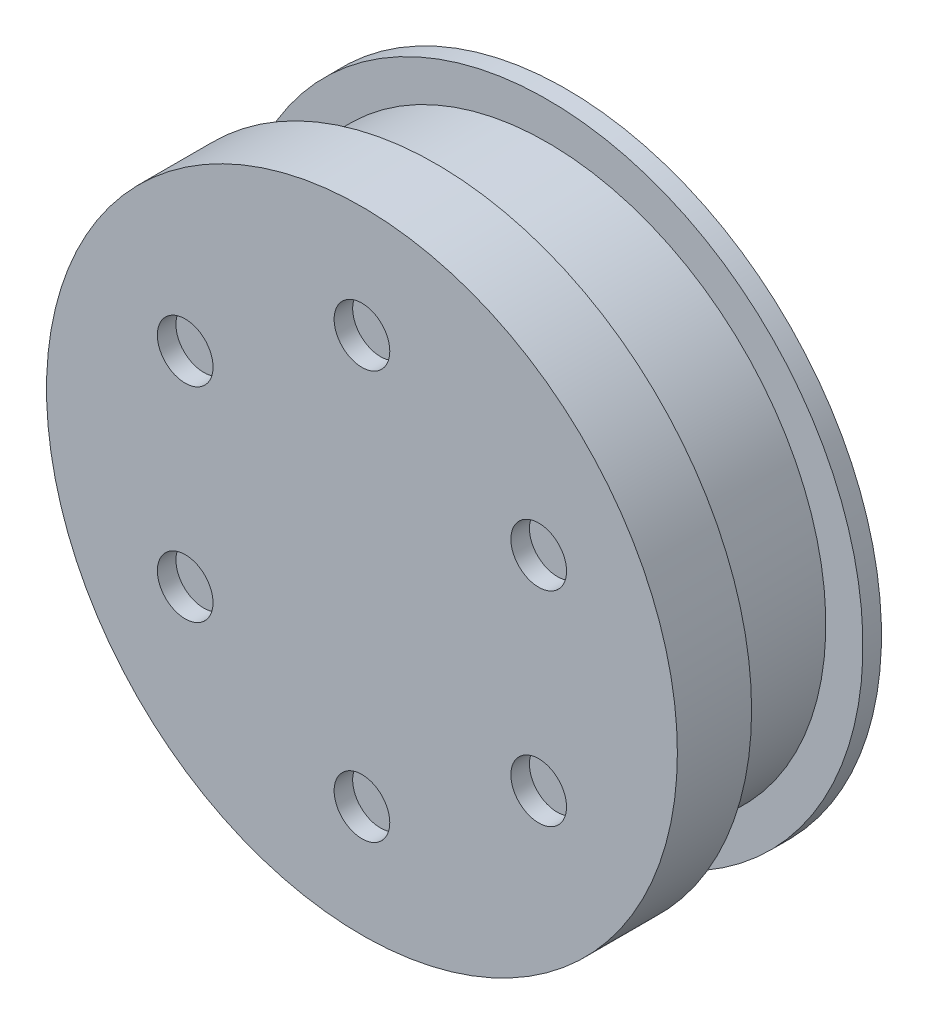
ISO-10303-21;
HEADER;
FILE_DESCRIPTION(('STEP AP214'),'2;1');
FILE_NAME('part.step','',(''),(''),'','','');
FILE_SCHEMA(('AUTOMOTIVE_DESIGN { 1 0 10303 214 1 1 1 1 }'));
ENDSEC;
DATA;
#1=APPLICATION_CONTEXT('core data for automotive mechanical design processes');
#2=APPLICATION_PROTOCOL_DEFINITION('international standard','automotive_design',2000,#1);
#3=PRODUCT_CONTEXT('',#1,'mechanical');
#4=PRODUCT('Part','Part','',(#3));
#5=PRODUCT_RELATED_PRODUCT_CATEGORY('part','',(#4));
#6=PRODUCT_DEFINITION_FORMATION('','',#4);
#7=PRODUCT_DEFINITION_CONTEXT('part definition',#1,'design');
#8=PRODUCT_DEFINITION('design','',#6,#7);
#9=PRODUCT_DEFINITION_SHAPE('','',#8);
#10=(LENGTH_UNIT() NAMED_UNIT(*) SI_UNIT(.MILLI.,.METRE.));
#11=(NAMED_UNIT(*) PLANE_ANGLE_UNIT() SI_UNIT($,.RADIAN.));
#12=(NAMED_UNIT(*) SI_UNIT($,.STERADIAN.) SOLID_ANGLE_UNIT());
#13=UNCERTAINTY_MEASURE_WITH_UNIT(LENGTH_MEASURE(1.E-05),#10,'distance_accuracy_value','');
#14=(GEOMETRIC_REPRESENTATION_CONTEXT(3) GLOBAL_UNCERTAINTY_ASSIGNED_CONTEXT((#13)) GLOBAL_UNIT_ASSIGNED_CONTEXT((#10,
#11,#12)) REPRESENTATION_CONTEXT('',''));
#15=CARTESIAN_POINT('',(0.,0.,0.));
#16=DIRECTION('',(0.,0.,1.));
#17=DIRECTION('',(1.,0.,0.));
#18=AXIS2_PLACEMENT_3D('',#15,#16,#17);
#19=CARTESIAN_POINT('',(0.,0.,8.));
#20=DIRECTION('',(0.,0.,-1.));
#21=DIRECTION('',(-1.,0.,0.));
#22=AXIS2_PLACEMENT_3D('',#19,#20,#21);
#23=CYLINDRICAL_SURFACE('',#22,15.);
#24=CARTESIAN_POINT('',(0.,0.,1.));
#25=DIRECTION('',(0.,0.,-1.));
#26=DIRECTION('',(-1.,0.,0.));
#27=AXIS2_PLACEMENT_3D('',#24,#25,#26);
#28=CIRCLE('',#27,15.);
#29=CARTESIAN_POINT('',(-15.,0.,1.));
#30=VERTEX_POINT('',#29);
#31=EDGE_CURVE('E45',#30,#30,#28,.T.);
#32=ORIENTED_EDGE('',*,*,#31,.F.);
#33=EDGE_LOOP('',(#32));
#34=FACE_BOUND('',#33,.T.);
#35=CARTESIAN_POINT('',(0.,0.,7.));
#36=DIRECTION('',(0.,0.,1.));
#37=DIRECTION('',(1.,0.,0.));
#38=AXIS2_PLACEMENT_3D('',#35,#36,#37);
#39=CIRCLE('',#38,15.);
#40=CARTESIAN_POINT('',(15.,0.,7.));
#41=VERTEX_POINT('',#40);
#42=EDGE_CURVE('E10',#41,#41,#39,.T.);
#43=ORIENTED_EDGE('',*,*,#42,.F.);
#44=EDGE_LOOP('',(#43));
#45=FACE_BOUND('',#44,.T.);
#46=ADVANCED_FACE('F39',(#34,#45),#23,.T.);
#47=CARTESIAN_POINT('',(0.,0.,1.));
#48=DIRECTION('',(0.,0.,-1.));
#49=DIRECTION('',(-1.,0.,0.));
#50=AXIS2_PLACEMENT_3D('',#47,#48,#49);
#51=CYLINDRICAL_SURFACE('',#50,17.);
#52=CARTESIAN_POINT('',(0.,0.,1.));
#53=DIRECTION('',(0.,0.,-1.));
#54=DIRECTION('',(-1.,0.,0.));
#55=AXIS2_PLACEMENT_3D('',#52,#53,#54);
#56=CIRCLE('',#55,17.);
#57=CARTESIAN_POINT('',(-17.,0.,1.));
#58=VERTEX_POINT('',#57);
#59=EDGE_CURVE('E49',#58,#58,#56,.T.);
#60=ORIENTED_EDGE('',*,*,#59,.T.);
#61=EDGE_LOOP('',(#60));
#62=FACE_BOUND('',#61,.T.);
#63=CARTESIAN_POINT('',(0.,0.,0.));
#64=DIRECTION('',(0.,0.,-1.));
#65=DIRECTION('',(-1.,0.,0.));
#66=AXIS2_PLACEMENT_3D('',#63,#64,#65);
#67=CIRCLE('',#66,17.);
#68=CARTESIAN_POINT('',(-17.,0.,0.));
#69=VERTEX_POINT('',#68);
#70=EDGE_CURVE('E53',#69,#69,#67,.T.);
#71=ORIENTED_EDGE('',*,*,#70,.F.);
#72=EDGE_LOOP('',(#71));
#73=FACE_BOUND('',#72,.T.);
#74=ADVANCED_FACE('F181',(#62,#73),#51,.T.);
#75=CARTESIAN_POINT('',(0.,0.,1.));
#76=DIRECTION('',(0.,0.,-1.));
#77=DIRECTION('',(-1.,0.,0.));
#78=AXIS2_PLACEMENT_3D('',#75,#76,#77);
#79=PLANE('',#78);
#80=ORIENTED_EDGE('',*,*,#31,.T.);
#81=EDGE_LOOP('',(#80));
#82=FACE_BOUND('',#81,.T.);
#83=ORIENTED_EDGE('',*,*,#59,.F.);
#84=EDGE_LOOP('',(#83));
#85=FACE_BOUND('',#84,.T.);
#86=ADVANCED_FACE('F186',(#82,#85),#79,.F.);
#87=CARTESIAN_POINT('',(0.,0.,0.));
#88=DIRECTION('',(0.,0.,1.));
#89=DIRECTION('',(1.,0.,0.));
#90=AXIS2_PLACEMENT_3D('',#87,#88,#89);
#91=PLANE('',#90);
#92=CARTESIAN_POINT('',(0.,11.,0.));
#93=DIRECTION('',(0.,0.,1.));
#94=DIRECTION('',(1.,0.,0.));
#95=AXIS2_PLACEMENT_3D('',#92,#93,#94);
#96=CIRCLE('',#95,1.5);
#97=CARTESIAN_POINT('',(1.5,11.,0.));
#98=VERTEX_POINT('',#97);
#99=EDGE_CURVE('E57',#98,#98,#96,.T.);
#100=ORIENTED_EDGE('',*,*,#99,.T.);
#101=EDGE_LOOP('',(#100));
#102=FACE_BOUND('',#101,.T.);
#103=CARTESIAN_POINT('',(-9.52627944162876,5.50000000000011,0.));
#104=DIRECTION('',(0.,0.,1.));
#105=DIRECTION('',(1.,0.,0.));
#106=AXIS2_PLACEMENT_3D('',#103,#104,#105);
#107=CIRCLE('',#106,1.5);
#108=CARTESIAN_POINT('',(-8.02627944162876,5.50000000000011,0.));
#109=VERTEX_POINT('',#108);
#110=EDGE_CURVE('E63',#109,#109,#107,.T.);
#111=ORIENTED_EDGE('',*,*,#110,.T.);
#112=EDGE_LOOP('',(#111));
#113=FACE_BOUND('',#112,.T.);
#114=CARTESIAN_POINT('',(-9.52627944162887,-5.49999999999991,0.));
#115=DIRECTION('',(0.,0.,1.));
#116=DIRECTION('',(1.,0.,0.));
#117=AXIS2_PLACEMENT_3D('',#114,#115,#116);
#118=CIRCLE('',#117,1.5);
#119=CARTESIAN_POINT('',(-8.02627944162887,-5.49999999999991,0.));
#120=VERTEX_POINT('',#119);
#121=EDGE_CURVE('E59',#120,#120,#118,.T.);
#122=ORIENTED_EDGE('',*,*,#121,.T.);
#123=EDGE_LOOP('',(#122));
#124=FACE_BOUND('',#123,.T.);
#125=CARTESIAN_POINT('',(0.,-11.,0.));
#126=DIRECTION('',(0.,0.,1.));
#127=DIRECTION('',(1.,0.,0.));
#128=AXIS2_PLACEMENT_3D('',#125,#126,#127);
#129=CIRCLE('',#128,1.5);
#130=CARTESIAN_POINT('',(1.49999999999992,-11.,0.));
#131=VERTEX_POINT('',#130);
#132=EDGE_CURVE('E62',#131,#131,#129,.T.);
#133=ORIENTED_EDGE('',*,*,#132,.T.);
#134=EDGE_LOOP('',(#133));
#135=FACE_BOUND('',#134,.T.);
#136=CARTESIAN_POINT('',(9.5262794416288,-5.50000000000005,0.));
#137=DIRECTION('',(0.,0.,1.));
#138=DIRECTION('',(1.,0.,0.));
#139=AXIS2_PLACEMENT_3D('',#136,#137,#138);
#140=CIRCLE('',#139,1.5);
#141=CARTESIAN_POINT('',(11.0262794416288,-5.50000000000005,0.));
#142=VERTEX_POINT('',#141);
#143=EDGE_CURVE('E71',#142,#142,#140,.T.);
#144=ORIENTED_EDGE('',*,*,#143,.T.);
#145=EDGE_LOOP('',(#144));
#146=FACE_BOUND('',#145,.T.);
#147=CARTESIAN_POINT('',(9.52627944162884,5.49999999999998,0.));
#148=DIRECTION('',(0.,0.,1.));
#149=DIRECTION('',(1.,0.,0.));
#150=AXIS2_PLACEMENT_3D('',#147,#148,#149);
#151=CIRCLE('',#150,1.5);
#152=CARTESIAN_POINT('',(11.0262794416288,5.49999999999998,0.));
#153=VERTEX_POINT('',#152);
#154=EDGE_CURVE('E77',#153,#153,#151,.T.);
#155=ORIENTED_EDGE('',*,*,#154,.T.);
#156=EDGE_LOOP('',(#155));
#157=FACE_BOUND('',#156,.T.);
#158=ORIENTED_EDGE('',*,*,#70,.T.);
#159=EDGE_LOOP('',(#158));
#160=FACE_BOUND('',#159,.T.);
#161=ADVANCED_FACE('F193',(#102,#113,#124,#135,#146,#157,#160),#91,.F.);
#162=CARTESIAN_POINT('',(9.52627944162884,5.49999999999998,0.));
#163=DIRECTION('',(0.,0.,1.));
#164=DIRECTION('',(1.,0.,0.));
#165=AXIS2_PLACEMENT_3D('',#162,#163,#164);
#166=CYLINDRICAL_SURFACE('',#165,1.5);
#167=ORIENTED_EDGE('',*,*,#154,.F.);
#168=EDGE_LOOP('',(#167));
#169=FACE_BOUND('',#168,.T.);
#170=CARTESIAN_POINT('',(9.52627944162884,5.49999999999998,8.));
#171=DIRECTION('',(0.,0.,1.));
#172=DIRECTION('',(1.,0.,0.));
#173=AXIS2_PLACEMENT_3D('',#170,#171,#172);
#174=CIRCLE('',#173,1.5);
#175=CARTESIAN_POINT('',(11.0262794416288,5.49999999999998,8.));
#176=VERTEX_POINT('',#175);
#177=EDGE_CURVE('E80',#176,#176,#174,.T.);
#178=ORIENTED_EDGE('',*,*,#177,.T.);
#179=EDGE_LOOP('',(#178));
#180=FACE_BOUND('',#179,.T.);
#181=ADVANCED_FACE('F198',(#169,#180),#166,.F.);
#182=CARTESIAN_POINT('',(9.5262794416288,-5.50000000000005,0.));
#183=DIRECTION('',(0.,0.,1.));
#184=DIRECTION('',(1.,0.,0.));
#185=AXIS2_PLACEMENT_3D('',#182,#183,#184);
#186=CYLINDRICAL_SURFACE('',#185,1.5);
#187=ORIENTED_EDGE('',*,*,#143,.F.);
#188=EDGE_LOOP('',(#187));
#189=FACE_BOUND('',#188,.T.);
#190=CARTESIAN_POINT('',(9.5262794416288,-5.50000000000005,8.));
#191=DIRECTION('',(0.,0.,1.));
#192=DIRECTION('',(1.,0.,0.));
#193=AXIS2_PLACEMENT_3D('',#190,#191,#192);
#194=CIRCLE('',#193,1.5);
#195=CARTESIAN_POINT('',(11.0262794416288,-5.50000000000005,8.));
#196=VERTEX_POINT('',#195);
#197=EDGE_CURVE('E74',#196,#196,#194,.T.);
#198=ORIENTED_EDGE('',*,*,#197,.T.);
#199=EDGE_LOOP('',(#198));
#200=FACE_BOUND('',#199,.T.);
#201=ADVANCED_FACE('F203',(#189,#200),#186,.F.);
#202=CARTESIAN_POINT('',(0.,-11.,0.));
#203=DIRECTION('',(0.,0.,1.));
#204=DIRECTION('',(1.,0.,0.));
#205=AXIS2_PLACEMENT_3D('',#202,#203,#204);
#206=CYLINDRICAL_SURFACE('',#205,1.5);
#207=ORIENTED_EDGE('',*,*,#132,.F.);
#208=EDGE_LOOP('',(#207));
#209=FACE_BOUND('',#208,.T.);
#210=CARTESIAN_POINT('',(0.,-11.,8.));
#211=DIRECTION('',(0.,0.,1.));
#212=DIRECTION('',(1.,0.,0.));
#213=AXIS2_PLACEMENT_3D('',#210,#211,#212);
#214=CIRCLE('',#213,1.5);
#215=CARTESIAN_POINT('',(1.49999999999992,-11.,8.));
#216=VERTEX_POINT('',#215);
#217=EDGE_CURVE('E68',#216,#216,#214,.T.);
#218=ORIENTED_EDGE('',*,*,#217,.T.);
#219=EDGE_LOOP('',(#218));
#220=FACE_BOUND('',#219,.T.);
#221=ADVANCED_FACE('F252',(#209,#220),#206,.F.);
#222=CARTESIAN_POINT('',(-9.52627944162887,-5.49999999999991,0.));
#223=DIRECTION('',(0.,0.,1.));
#224=DIRECTION('',(1.,0.,0.));
#225=AXIS2_PLACEMENT_3D('',#222,#223,#224);
#226=CYLINDRICAL_SURFACE('',#225,1.5);
#227=ORIENTED_EDGE('',*,*,#121,.F.);
#228=EDGE_LOOP('',(#227));
#229=FACE_BOUND('',#228,.T.);
#230=CARTESIAN_POINT('',(-9.52627944162887,-5.49999999999991,8.));
#231=DIRECTION('',(0.,0.,1.));
#232=DIRECTION('',(1.,0.,0.));
#233=AXIS2_PLACEMENT_3D('',#230,#231,#232);
#234=CIRCLE('',#233,1.5);
#235=CARTESIAN_POINT('',(-8.02627944162887,-5.49999999999991,8.));
#236=VERTEX_POINT('',#235);
#237=EDGE_CURVE('E64',#236,#236,#234,.T.);
#238=ORIENTED_EDGE('',*,*,#237,.T.);
#239=EDGE_LOOP('',(#238));
#240=FACE_BOUND('',#239,.T.);
#241=ADVANCED_FACE('F246',(#229,#240),#226,.F.);
#242=CARTESIAN_POINT('',(-9.52627944162876,5.50000000000011,0.));
#243=DIRECTION('',(0.,0.,1.));
#244=DIRECTION('',(1.,0.,0.));
#245=AXIS2_PLACEMENT_3D('',#242,#243,#244);
#246=CYLINDRICAL_SURFACE('',#245,1.5);
#247=ORIENTED_EDGE('',*,*,#110,.F.);
#248=EDGE_LOOP('',(#247));
#249=FACE_BOUND('',#248,.T.);
#250=CARTESIAN_POINT('',(-9.52627944162876,5.50000000000011,8.));
#251=DIRECTION('',(0.,0.,1.));
#252=DIRECTION('',(1.,0.,0.));
#253=AXIS2_PLACEMENT_3D('',#250,#251,#252);
#254=CIRCLE('',#253,1.5);
#255=CARTESIAN_POINT('',(-8.02627944162876,5.50000000000011,8.));
#256=VERTEX_POINT('',#255);
#257=EDGE_CURVE('E67',#256,#256,#254,.T.);
#258=ORIENTED_EDGE('',*,*,#257,.T.);
#259=EDGE_LOOP('',(#258));
#260=FACE_BOUND('',#259,.T.);
#261=ADVANCED_FACE('F177',(#249,#260),#246,.F.);
#262=CARTESIAN_POINT('',(0.,11.,0.));
#263=DIRECTION('',(0.,0.,1.));
#264=DIRECTION('',(1.,0.,0.));
#265=AXIS2_PLACEMENT_3D('',#262,#263,#264);
#266=CYLINDRICAL_SURFACE('',#265,1.5);
#267=ORIENTED_EDGE('',*,*,#99,.F.);
#268=EDGE_LOOP('',(#267));
#269=FACE_BOUND('',#268,.T.);
#270=CARTESIAN_POINT('',(0.,11.,8.));
#271=DIRECTION('',(0.,0.,1.));
#272=DIRECTION('',(1.,0.,0.));
#273=AXIS2_PLACEMENT_3D('',#270,#271,#272);
#274=CIRCLE('',#273,1.5);
#275=CARTESIAN_POINT('',(1.5,11.,8.));
#276=VERTEX_POINT('',#275);
#277=EDGE_CURVE('E91',#276,#276,#274,.T.);
#278=ORIENTED_EDGE('',*,*,#277,.T.);
#279=EDGE_LOOP('',(#278));
#280=FACE_BOUND('',#279,.T.);
#281=ADVANCED_FACE('F167',(#269,#280),#266,.F.);
#282=CARTESIAN_POINT('',(0.,0.,7.));
#283=DIRECTION('',(0.,0.,1.));
#284=DIRECTION('',(1.,0.,0.));
#285=AXIS2_PLACEMENT_3D('',#282,#283,#284);
#286=CYLINDRICAL_SURFACE('',#285,17.);
#287=CARTESIAN_POINT('',(0.,0.,7.));
#288=DIRECTION('',(0.,0.,1.));
#289=DIRECTION('',(1.,0.,0.));
#290=AXIS2_PLACEMENT_3D('',#287,#288,#289);
#291=CIRCLE('',#290,17.);
#292=CARTESIAN_POINT('',(17.,0.,7.));
#293=VERTEX_POINT('',#292);
#294=EDGE_CURVE('E88',#293,#293,#291,.T.);
#295=ORIENTED_EDGE('',*,*,#294,.T.);
#296=EDGE_LOOP('',(#295));
#297=FACE_BOUND('',#296,.T.);
#298=CARTESIAN_POINT('',(0.,0.,11.));
#299=DIRECTION('',(0.,0.,1.));
#300=DIRECTION('',(1.,0.,0.));
#301=AXIS2_PLACEMENT_3D('',#298,#299,#300);
#302=CIRCLE('',#301,17.);
#303=CARTESIAN_POINT('',(17.,0.,11.));
#304=VERTEX_POINT('',#303);
#305=EDGE_CURVE('E85',#304,#304,#302,.T.);
#306=ORIENTED_EDGE('',*,*,#305,.F.);
#307=EDGE_LOOP('',(#306));
#308=FACE_BOUND('',#307,.T.);
#309=ADVANCED_FACE('F164',(#297,#308),#286,.T.);
#310=CARTESIAN_POINT('',(0.,0.,7.));
#311=DIRECTION('',(0.,0.,1.));
#312=DIRECTION('',(1.,0.,0.));
#313=AXIS2_PLACEMENT_3D('',#310,#311,#312);
#314=PLANE('',#313);
#315=ORIENTED_EDGE('',*,*,#42,.T.);
#316=EDGE_LOOP('',(#315));
#317=FACE_BOUND('',#316,.T.);
#318=ORIENTED_EDGE('',*,*,#294,.F.);
#319=EDGE_LOOP('',(#318));
#320=FACE_BOUND('',#319,.T.);
#321=ADVANCED_FACE('F166',(#317,#320),#314,.F.);
#322=CARTESIAN_POINT('',(0.,0.,8.));
#323=DIRECTION('',(0.,0.,1.));
#324=DIRECTION('',(1.,0.,0.));
#325=AXIS2_PLACEMENT_3D('',#322,#323,#324);
#326=PLANE('',#325);
#327=ORIENTED_EDGE('',*,*,#177,.F.);
#328=EDGE_LOOP('',(#327));
#329=FACE_BOUND('',#328,.T.);
#330=ADVANCED_FACE('F174',(#329),#326,.F.);
#331=ORIENTED_EDGE('',*,*,#197,.F.);
#332=EDGE_LOOP('',(#331));
#333=FACE_BOUND('',#332,.T.);
#334=ADVANCED_FACE('F222',(#333),#326,.F.);
#335=ORIENTED_EDGE('',*,*,#217,.F.);
#336=EDGE_LOOP('',(#335));
#337=FACE_BOUND('',#336,.T.);
#338=ADVANCED_FACE('F227',(#337),#326,.F.);
#339=ORIENTED_EDGE('',*,*,#237,.F.);
#340=EDGE_LOOP('',(#339));
#341=FACE_BOUND('',#340,.T.);
#342=ADVANCED_FACE('F235',(#341),#326,.F.);
#343=ORIENTED_EDGE('',*,*,#257,.F.);
#344=EDGE_LOOP('',(#343));
#345=FACE_BOUND('',#344,.T.);
#346=ADVANCED_FACE('F230',(#345),#326,.F.);
#347=ORIENTED_EDGE('',*,*,#277,.F.);
#348=EDGE_LOOP('',(#347));
#349=FACE_BOUND('',#348,.T.);
#350=ADVANCED_FACE('F150',(#349),#326,.F.);
#351=CARTESIAN_POINT('',(0.,0.,11.));
#352=DIRECTION('',(0.,0.,1.));
#353=DIRECTION('',(1.,0.,0.));
#354=AXIS2_PLACEMENT_3D('',#351,#352,#353);
#355=PLANE('',#354);
#356=CARTESIAN_POINT('',(0.,11.,11.));
#357=DIRECTION('',(0.,0.,1.));
#358=DIRECTION('',(1.,0.,0.));
#359=AXIS2_PLACEMENT_3D('',#356,#357,#358);
#360=CIRCLE('',#359,1.5);
#361=CARTESIAN_POINT('',(1.5,11.,11.));
#362=VERTEX_POINT('',#361);
#363=EDGE_CURVE('E126',#362,#362,#360,.T.);
#364=ORIENTED_EDGE('',*,*,#363,.F.);
#365=EDGE_LOOP('',(#364));
#366=FACE_BOUND('',#365,.T.);
#367=CARTESIAN_POINT('',(-9.52627944162876,5.50000000000011,11.));
#368=DIRECTION('',(0.,0.,1.));
#369=DIRECTION('',(1.,0.,0.));
#370=AXIS2_PLACEMENT_3D('',#367,#368,#369);
#371=CIRCLE('',#370,1.5);
#372=CARTESIAN_POINT('',(-8.02627944162876,5.50000000000011,11.));
#373=VERTEX_POINT('',#372);
#374=EDGE_CURVE('E105',#373,#373,#371,.T.);
#375=ORIENTED_EDGE('',*,*,#374,.F.);
#376=EDGE_LOOP('',(#375));
#377=FACE_BOUND('',#376,.T.);
#378=CARTESIAN_POINT('',(-9.52627944162887,-5.49999999999991,11.));
#379=DIRECTION('',(0.,0.,1.));
#380=DIRECTION('',(1.,0.,0.));
#381=AXIS2_PLACEMENT_3D('',#378,#379,#380);
#382=CIRCLE('',#381,1.5);
#383=CARTESIAN_POINT('',(-8.02627944162887,-5.49999999999991,11.));
#384=VERTEX_POINT('',#383);
#385=EDGE_CURVE('E104',#384,#384,#382,.T.);
#386=ORIENTED_EDGE('',*,*,#385,.F.);
#387=EDGE_LOOP('',(#386));
#388=FACE_BOUND('',#387,.T.);
#389=CARTESIAN_POINT('',(0.,-11.,11.));
#390=DIRECTION('',(0.,0.,1.));
#391=DIRECTION('',(1.,0.,0.));
#392=AXIS2_PLACEMENT_3D('',#389,#390,#391);
#393=CIRCLE('',#392,1.5);
#394=CARTESIAN_POINT('',(1.49999999999992,-11.,11.));
#395=VERTEX_POINT('',#394);
#396=EDGE_CURVE('E111',#395,#395,#393,.T.);
#397=ORIENTED_EDGE('',*,*,#396,.F.);
#398=EDGE_LOOP('',(#397));
#399=FACE_BOUND('',#398,.T.);
#400=CARTESIAN_POINT('',(9.5262794416288,-5.50000000000005,11.));
#401=DIRECTION('',(0.,0.,1.));
#402=DIRECTION('',(1.,0.,0.));
#403=AXIS2_PLACEMENT_3D('',#400,#401,#402);
#404=CIRCLE('',#403,1.5);
#405=CARTESIAN_POINT('',(11.0262794416288,-5.50000000000005,11.));
#406=VERTEX_POINT('',#405);
#407=EDGE_CURVE('E117',#406,#406,#404,.T.);
#408=ORIENTED_EDGE('',*,*,#407,.F.);
#409=EDGE_LOOP('',(#408));
#410=FACE_BOUND('',#409,.T.);
#411=CARTESIAN_POINT('',(9.52627944162884,5.49999999999998,11.));
#412=DIRECTION('',(0.,0.,1.));
#413=DIRECTION('',(1.,0.,0.));
#414=AXIS2_PLACEMENT_3D('',#411,#412,#413);
#415=CIRCLE('',#414,1.5);
#416=CARTESIAN_POINT('',(11.0262794416288,5.49999999999998,11.));
#417=VERTEX_POINT('',#416);
#418=EDGE_CURVE('E123',#417,#417,#415,.T.);
#419=ORIENTED_EDGE('',*,*,#418,.F.);
#420=EDGE_LOOP('',(#419));
#421=FACE_BOUND('',#420,.T.);
#422=ORIENTED_EDGE('',*,*,#305,.T.);
#423=EDGE_LOOP('',(#422));
#424=FACE_BOUND('',#423,.T.);
#425=ADVANCED_FACE('F146',(#366,#377,#388,#399,#410,#421,#424),#355,.T.);
#426=CARTESIAN_POINT('',(9.52627944162884,5.49999999999998,10.));
#427=DIRECTION('',(0.,0.,1.));
#428=DIRECTION('',(1.,0.,0.));
#429=AXIS2_PLACEMENT_3D('',#426,#427,#428);
#430=CYLINDRICAL_SURFACE('',#429,1.5);
#431=CARTESIAN_POINT('',(9.52627944162884,5.49999999999998,10.));
#432=DIRECTION('',(0.,0.,1.));
#433=DIRECTION('',(1.,0.,0.));
#434=AXIS2_PLACEMENT_3D('',#431,#432,#433);
#435=CIRCLE('',#434,1.5);
#436=CARTESIAN_POINT('',(11.0262794416288,5.49999999999998,10.));
#437=VERTEX_POINT('',#436);
#438=EDGE_CURVE('E120',#437,#437,#435,.T.);
#439=ORIENTED_EDGE('',*,*,#438,.F.);
#440=EDGE_LOOP('',(#439));
#441=FACE_BOUND('',#440,.T.);
#442=ORIENTED_EDGE('',*,*,#418,.T.);
#443=EDGE_LOOP('',(#442));
#444=FACE_BOUND('',#443,.T.);
#445=ADVANCED_FACE('F149',(#441,#444),#430,.F.);
#446=CARTESIAN_POINT('',(9.52627944162884,5.49999999999998,10.));
#447=DIRECTION('',(0.,0.,1.));
#448=DIRECTION('',(1.,0.,0.));
#449=AXIS2_PLACEMENT_3D('',#446,#447,#448);
#450=PLANE('',#449);
#451=ORIENTED_EDGE('',*,*,#438,.T.);
#452=EDGE_LOOP('',(#451));
#453=FACE_BOUND('',#452,.T.);
#454=ADVANCED_FACE('F299',(#453),#450,.T.);
#455=CARTESIAN_POINT('',(9.5262794416288,-5.50000000000005,10.));
#456=DIRECTION('',(0.,0.,1.));
#457=DIRECTION('',(1.,0.,0.));
#458=AXIS2_PLACEMENT_3D('',#455,#456,#457);
#459=CYLINDRICAL_SURFACE('',#458,1.5);
#460=CARTESIAN_POINT('',(9.5262794416288,-5.50000000000005,10.));
#461=DIRECTION('',(0.,0.,1.));
#462=DIRECTION('',(1.,0.,0.));
#463=AXIS2_PLACEMENT_3D('',#460,#461,#462);
#464=CIRCLE('',#463,1.5);
#465=CARTESIAN_POINT('',(11.0262794416288,-5.50000000000005,10.));
#466=VERTEX_POINT('',#465);
#467=EDGE_CURVE('E114',#466,#466,#464,.T.);
#468=ORIENTED_EDGE('',*,*,#467,.F.);
#469=EDGE_LOOP('',(#468));
#470=FACE_BOUND('',#469,.T.);
#471=ORIENTED_EDGE('',*,*,#407,.T.);
#472=EDGE_LOOP('',(#471));
#473=FACE_BOUND('',#472,.T.);
#474=ADVANCED_FACE('F309',(#470,#473),#459,.F.);
#475=CARTESIAN_POINT('',(9.5262794416288,-5.50000000000005,10.));
#476=DIRECTION('',(0.,0.,1.));
#477=DIRECTION('',(1.,0.,0.));
#478=AXIS2_PLACEMENT_3D('',#475,#476,#477);
#479=PLANE('',#478);
#480=ORIENTED_EDGE('',*,*,#467,.T.);
#481=EDGE_LOOP('',(#480));
#482=FACE_BOUND('',#481,.T.);
#483=ADVANCED_FACE('F319',(#482),#479,.T.);
#484=CARTESIAN_POINT('',(0.,-11.,10.));
#485=DIRECTION('',(0.,0.,1.));
#486=DIRECTION('',(1.,0.,0.));
#487=AXIS2_PLACEMENT_3D('',#484,#485,#486);
#488=CYLINDRICAL_SURFACE('',#487,1.5);
#489=CARTESIAN_POINT('',(0.,-11.,10.));
#490=DIRECTION('',(0.,0.,1.));
#491=DIRECTION('',(1.,0.,0.));
#492=AXIS2_PLACEMENT_3D('',#489,#490,#491);
#493=CIRCLE('',#492,1.5);
#494=CARTESIAN_POINT('',(1.49999999999992,-11.,10.));
#495=VERTEX_POINT('',#494);
#496=EDGE_CURVE('E108',#495,#495,#493,.T.);
#497=ORIENTED_EDGE('',*,*,#496,.F.);
#498=EDGE_LOOP('',(#497));
#499=FACE_BOUND('',#498,.T.);
#500=ORIENTED_EDGE('',*,*,#396,.T.);
#501=EDGE_LOOP('',(#500));
#502=FACE_BOUND('',#501,.T.);
#503=ADVANCED_FACE('F329',(#499,#502),#488,.F.);
#504=CARTESIAN_POINT('',(0.,-11.,10.));
#505=DIRECTION('',(0.,0.,1.));
#506=DIRECTION('',(1.,0.,0.));
#507=AXIS2_PLACEMENT_3D('',#504,#505,#506);
#508=PLANE('',#507);
#509=ORIENTED_EDGE('',*,*,#496,.T.);
#510=EDGE_LOOP('',(#509));
#511=FACE_BOUND('',#510,.T.);
#512=ADVANCED_FACE('F339',(#511),#508,.T.);
#513=CARTESIAN_POINT('',(-9.52627944162887,-5.49999999999991,10.));
#514=DIRECTION('',(0.,0.,1.));
#515=DIRECTION('',(1.,0.,0.));
#516=AXIS2_PLACEMENT_3D('',#513,#514,#515);
#517=CYLINDRICAL_SURFACE('',#516,1.5);
#518=CARTESIAN_POINT('',(-9.52627944162887,-5.49999999999991,10.));
#519=DIRECTION('',(0.,0.,1.));
#520=DIRECTION('',(1.,0.,0.));
#521=AXIS2_PLACEMENT_3D('',#518,#519,#520);
#522=CIRCLE('',#521,1.5);
#523=CARTESIAN_POINT('',(-8.02627944162887,-5.49999999999991,10.));
#524=VERTEX_POINT('',#523);
#525=EDGE_CURVE('E101',#524,#524,#522,.T.);
#526=ORIENTED_EDGE('',*,*,#525,.F.);
#527=EDGE_LOOP('',(#526));
#528=FACE_BOUND('',#527,.T.);
#529=ORIENTED_EDGE('',*,*,#385,.T.);
#530=EDGE_LOOP('',(#529));
#531=FACE_BOUND('',#530,.T.);
#532=ADVANCED_FACE('F349',(#528,#531),#517,.F.);
#533=CARTESIAN_POINT('',(-9.52627944162887,-5.49999999999991,10.));
#534=DIRECTION('',(0.,0.,1.));
#535=DIRECTION('',(1.,0.,0.));
#536=AXIS2_PLACEMENT_3D('',#533,#534,#535);
#537=PLANE('',#536);
#538=ORIENTED_EDGE('',*,*,#525,.T.);
#539=EDGE_LOOP('',(#538));
#540=FACE_BOUND('',#539,.T.);
#541=ADVANCED_FACE('F359',(#540),#537,.T.);
#542=CARTESIAN_POINT('',(-9.52627944162876,5.50000000000011,10.));
#543=DIRECTION('',(0.,0.,1.));
#544=DIRECTION('',(1.,0.,0.));
#545=AXIS2_PLACEMENT_3D('',#542,#543,#544);
#546=CYLINDRICAL_SURFACE('',#545,1.5);
#547=CARTESIAN_POINT('',(-9.52627944162876,5.50000000000011,10.));
#548=DIRECTION('',(0.,0.,1.));
#549=DIRECTION('',(1.,0.,0.));
#550=AXIS2_PLACEMENT_3D('',#547,#548,#549);
#551=CIRCLE('',#550,1.5);
#552=CARTESIAN_POINT('',(-8.02627944162876,5.50000000000011,10.));
#553=VERTEX_POINT('',#552);
#554=EDGE_CURVE('E127',#553,#553,#551,.T.);
#555=ORIENTED_EDGE('',*,*,#554,.F.);
#556=EDGE_LOOP('',(#555));
#557=FACE_BOUND('',#556,.T.);
#558=ORIENTED_EDGE('',*,*,#374,.T.);
#559=EDGE_LOOP('',(#558));
#560=FACE_BOUND('',#559,.T.);
#561=ADVANCED_FACE('F369',(#557,#560),#546,.F.);
#562=CARTESIAN_POINT('',(-9.52627944162876,5.50000000000011,10.));
#563=DIRECTION('',(0.,0.,1.));
#564=DIRECTION('',(1.,0.,0.));
#565=AXIS2_PLACEMENT_3D('',#562,#563,#564);
#566=PLANE('',#565);
#567=ORIENTED_EDGE('',*,*,#554,.T.);
#568=EDGE_LOOP('',(#567));
#569=FACE_BOUND('',#568,.T.);
#570=ADVANCED_FACE('F142',(#569),#566,.T.);
#571=CARTESIAN_POINT('',(0.,11.,10.));
#572=DIRECTION('',(0.,0.,1.));
#573=DIRECTION('',(1.,0.,0.));
#574=AXIS2_PLACEMENT_3D('',#571,#572,#573);
#575=CYLINDRICAL_SURFACE('',#574,1.5);
#576=CARTESIAN_POINT('',(0.,11.,10.));
#577=DIRECTION('',(0.,0.,1.));
#578=DIRECTION('',(1.,0.,0.));
#579=AXIS2_PLACEMENT_3D('',#576,#577,#578);
#580=CIRCLE('',#579,1.5);
#581=CARTESIAN_POINT('',(1.5,11.,10.));
#582=VERTEX_POINT('',#581);
#583=EDGE_CURVE('E100',#582,#582,#580,.T.);
#584=ORIENTED_EDGE('',*,*,#583,.F.);
#585=EDGE_LOOP('',(#584));
#586=FACE_BOUND('',#585,.T.);
#587=ORIENTED_EDGE('',*,*,#363,.T.);
#588=EDGE_LOOP('',(#587));
#589=FACE_BOUND('',#588,.T.);
#590=ADVANCED_FACE('F139',(#586,#589),#575,.F.);
#591=CARTESIAN_POINT('',(0.,11.,10.));
#592=DIRECTION('',(0.,0.,1.));
#593=DIRECTION('',(1.,0.,0.));
#594=AXIS2_PLACEMENT_3D('',#591,#592,#593);
#595=PLANE('',#594);
#596=ORIENTED_EDGE('',*,*,#583,.T.);
#597=EDGE_LOOP('',(#596));
#598=FACE_BOUND('',#597,.T.);
#599=ADVANCED_FACE('F137',(#598),#595,.T.);
#600=CLOSED_SHELL('',(#46,#74,#86,#161,#181,#201,#221,#241,#261,#281,#309,#321,#330,#334,#338,
#342,#346,#350,#425,#445,#454,#474,#483,#503,#512,#532,#541,#561,#570,#590,#599));
#601=MANIFOLD_SOLID_BREP('B2',#600);
#602=ADVANCED_BREP_SHAPE_REPRESENTATION('',(#18,#601),#14);
#603=SHAPE_DEFINITION_REPRESENTATION(#9,#602);
ENDSEC;
END-ISO-10303-21;
